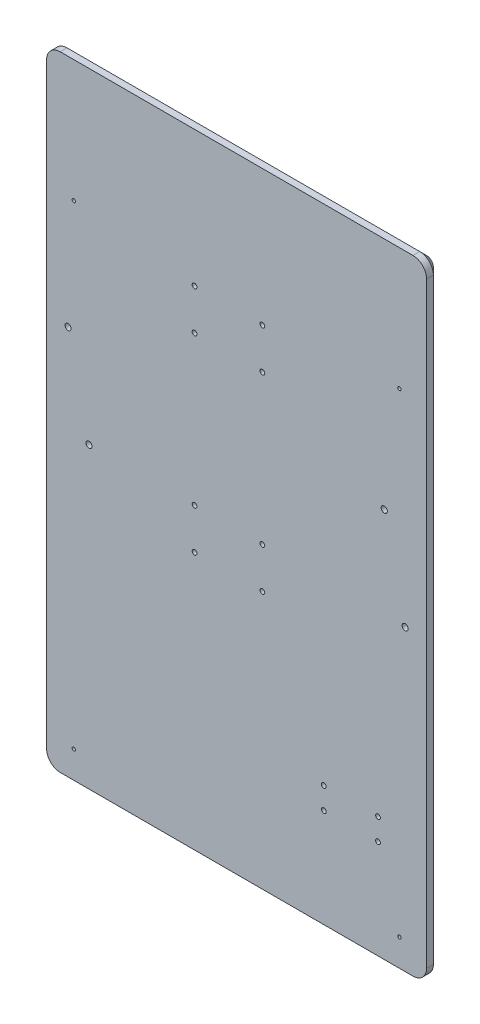
ISO-10303-21;
HEADER;
FILE_DESCRIPTION(('STEP AP214'),'2;1');
FILE_NAME('part.step','',(''),(''),'','','');
FILE_SCHEMA(('AUTOMOTIVE_DESIGN { 1 0 10303 214 1 1 1 1 }'));
ENDSEC;
DATA;
#1=APPLICATION_CONTEXT('core data for automotive mechanical design processes');
#2=APPLICATION_PROTOCOL_DEFINITION('international standard','automotive_design',2000,#1);
#3=PRODUCT_CONTEXT('',#1,'mechanical');
#4=PRODUCT('Part','Part','',(#3));
#5=PRODUCT_RELATED_PRODUCT_CATEGORY('part','',(#4));
#6=PRODUCT_DEFINITION_FORMATION('','',#4);
#7=PRODUCT_DEFINITION_CONTEXT('part definition',#1,'design');
#8=PRODUCT_DEFINITION('design','',#6,#7);
#9=PRODUCT_DEFINITION_SHAPE('','',#8);
#10=(LENGTH_UNIT() NAMED_UNIT(*) SI_UNIT(.MILLI.,.METRE.));
#11=(NAMED_UNIT(*) PLANE_ANGLE_UNIT() SI_UNIT($,.RADIAN.));
#12=(NAMED_UNIT(*) SI_UNIT($,.STERADIAN.) SOLID_ANGLE_UNIT());
#13=UNCERTAINTY_MEASURE_WITH_UNIT(LENGTH_MEASURE(1.E-05),#10,'distance_accuracy_value','');
#14=(GEOMETRIC_REPRESENTATION_CONTEXT(3) GLOBAL_UNCERTAINTY_ASSIGNED_CONTEXT((#13)) GLOBAL_UNIT_ASSIGNED_CONTEXT((#10,
#11,#12)) REPRESENTATION_CONTEXT('',''));
#15=CARTESIAN_POINT('',(0.,0.,0.));
#16=DIRECTION('',(0.,0.,1.));
#17=DIRECTION('',(1.,0.,0.));
#18=AXIS2_PLACEMENT_3D('',#15,#16,#17);
#19=CARTESIAN_POINT('',(146.,234.9692,10.));
#20=DIRECTION('',(-1.,0.,0.));
#21=DIRECTION('',(0.,-1.,0.));
#22=AXIS2_PLACEMENT_3D('',#19,#20,#21);
#23=PLANE('',#22);
#24=DIRECTION('',(0.,0.,-1.));
#25=VECTOR('',#24,1.);
#26=CARTESIAN_POINT('',(146.,-215.0308,10.));
#27=LINE('',#26,#25);
#28=CARTESIAN_POINT('',(146.,-215.0308,10.));
#29=VERTEX_POINT('',#28);
#30=CARTESIAN_POINT('',(146.,-215.0308,5.00000000000006));
#31=VERTEX_POINT('',#30);
#32=EDGE_CURVE('E181',#29,#31,#27,.T.);
#33=ORIENTED_EDGE('',*,*,#32,.T.);
#34=DIRECTION('',(0.,1.,0.));
#35=VECTOR('',#34,1.);
#36=CARTESIAN_POINT('',(146.,224.9692,5.00000000000006));
#37=LINE('',#36,#35);
#38=CARTESIAN_POINT('',(146.,224.9692,5.00000000000006));
#39=VERTEX_POINT('',#38);
#40=EDGE_CURVE('E208',#31,#39,#37,.T.);
#41=ORIENTED_EDGE('',*,*,#40,.T.);
#42=DIRECTION('',(0.,0.,-1.));
#43=VECTOR('',#42,1.);
#44=CARTESIAN_POINT('',(146.,224.9692,10.));
#45=LINE('',#44,#43);
#46=CARTESIAN_POINT('',(146.,224.9692,10.));
#47=VERTEX_POINT('',#46);
#48=EDGE_CURVE('E184',#39,#47,#45,.F.);
#49=ORIENTED_EDGE('',*,*,#48,.T.);
#50=DIRECTION('',(0.,1.,0.));
#51=VECTOR('',#50,1.);
#52=CARTESIAN_POINT('',(146.,234.9692,10.));
#53=LINE('',#52,#51);
#54=EDGE_CURVE('E360',#29,#47,#53,.T.);
#55=ORIENTED_EDGE('',*,*,#54,.F.);
#56=EDGE_LOOP('',(#33,#41,#49,#55));
#57=FACE_BOUND('',#56,.T.);
#58=ADVANCED_FACE('F47',(#57),#23,.F.);
#59=CARTESIAN_POINT('',(146.,234.9692,10.));
#60=DIRECTION('',(0.,-1.,0.));
#61=DIRECTION('',(1.,0.,0.));
#62=AXIS2_PLACEMENT_3D('',#59,#60,#61);
#63=PLANE('',#62);
#64=DIRECTION('',(0.,0.,-1.));
#65=VECTOR('',#64,1.);
#66=CARTESIAN_POINT('',(136.,234.9692,10.));
#67=LINE('',#66,#65);
#68=CARTESIAN_POINT('',(136.,234.9692,10.));
#69=VERTEX_POINT('',#68);
#70=CARTESIAN_POINT('',(136.,234.9692,5.00000000000006));
#71=VERTEX_POINT('',#70);
#72=EDGE_CURVE('E150',#69,#71,#67,.T.);
#73=ORIENTED_EDGE('',*,*,#72,.T.);
#74=DIRECTION('',(-1.,0.,0.));
#75=VECTOR('',#74,1.);
#76=CARTESIAN_POINT('',(-124.,234.9692,5.00000000000006));
#77=LINE('',#76,#75);
#78=CARTESIAN_POINT('',(-124.,234.9692,5.00000000000006));
#79=VERTEX_POINT('',#78);
#80=EDGE_CURVE('E11',#71,#79,#77,.T.);
#81=ORIENTED_EDGE('',*,*,#80,.T.);
#82=DIRECTION('',(0.,0.,-1.));
#83=VECTOR('',#82,1.);
#84=CARTESIAN_POINT('',(-124.,234.9692,10.));
#85=LINE('',#84,#83);
#86=CARTESIAN_POINT('',(-124.,234.9692,10.));
#87=VERTEX_POINT('',#86);
#88=EDGE_CURVE('E179',#79,#87,#85,.F.);
#89=ORIENTED_EDGE('',*,*,#88,.T.);
#90=DIRECTION('',(-1.,0.,0.));
#91=VECTOR('',#90,1.);
#92=CARTESIAN_POINT('',(146.,234.9692,10.));
#93=LINE('',#92,#91);
#94=EDGE_CURVE('E365',#69,#87,#93,.T.);
#95=ORIENTED_EDGE('',*,*,#94,.F.);
#96=EDGE_LOOP('',(#73,#81,#89,#95));
#97=FACE_BOUND('',#96,.T.);
#98=ADVANCED_FACE('F418',(#97),#63,.F.);
#99=CARTESIAN_POINT('',(-134.,234.9692,10.));
#100=DIRECTION('',(1.,0.,0.));
#101=DIRECTION('',(0.,1.,0.));
#102=AXIS2_PLACEMENT_3D('',#99,#100,#101);
#103=PLANE('',#102);
#104=DIRECTION('',(0.,0.,-1.));
#105=VECTOR('',#104,1.);
#106=CARTESIAN_POINT('',(-134.,224.9692,10.));
#107=LINE('',#106,#105);
#108=CARTESIAN_POINT('',(-134.,224.9692,10.));
#109=VERTEX_POINT('',#108);
#110=CARTESIAN_POINT('',(-134.,224.9692,5.00000000000006));
#111=VERTEX_POINT('',#110);
#112=EDGE_CURVE('E165',#109,#111,#107,.T.);
#113=ORIENTED_EDGE('',*,*,#112,.T.);
#114=DIRECTION('',(0.,-1.,0.));
#115=VECTOR('',#114,1.);
#116=CARTESIAN_POINT('',(-134.,-215.0308,5.00000000000006));
#117=LINE('',#116,#115);
#118=CARTESIAN_POINT('',(-134.,-215.0308,5.00000000000006));
#119=VERTEX_POINT('',#118);
#120=EDGE_CURVE('E210',#111,#119,#117,.T.);
#121=ORIENTED_EDGE('',*,*,#120,.T.);
#122=DIRECTION('',(0.,0.,-1.));
#123=VECTOR('',#122,1.);
#124=CARTESIAN_POINT('',(-134.,-215.0308,10.));
#125=LINE('',#124,#123);
#126=CARTESIAN_POINT('',(-134.,-215.0308,10.));
#127=VERTEX_POINT('',#126);
#128=EDGE_CURVE('E168',#119,#127,#125,.F.);
#129=ORIENTED_EDGE('',*,*,#128,.T.);
#130=DIRECTION('',(0.,-1.,0.));
#131=VECTOR('',#130,1.);
#132=CARTESIAN_POINT('',(-134.,234.9692,10.));
#133=LINE('',#132,#131);
#134=EDGE_CURVE('E146',#109,#127,#133,.T.);
#135=ORIENTED_EDGE('',*,*,#134,.F.);
#136=EDGE_LOOP('',(#113,#121,#129,#135));
#137=FACE_BOUND('',#136,.T.);
#138=ADVANCED_FACE('F376',(#137),#103,.F.);
#139=CARTESIAN_POINT('',(146.,-225.0308,10.));
#140=DIRECTION('',(0.,1.,0.));
#141=DIRECTION('',(-1.,0.,0.));
#142=AXIS2_PLACEMENT_3D('',#139,#140,#141);
#143=PLANE('',#142);
#144=DIRECTION('',(0.,0.,-1.));
#145=VECTOR('',#144,1.);
#146=CARTESIAN_POINT('',(-124.,-225.0308,10.));
#147=LINE('',#146,#145);
#148=CARTESIAN_POINT('',(-124.,-225.0308,10.));
#149=VERTEX_POINT('',#148);
#150=CARTESIAN_POINT('',(-124.,-225.0308,5.00000000000006));
#151=VERTEX_POINT('',#150);
#152=EDGE_CURVE('E157',#149,#151,#147,.T.);
#153=ORIENTED_EDGE('',*,*,#152,.T.);
#154=DIRECTION('',(1.,0.,0.));
#155=VECTOR('',#154,1.);
#156=CARTESIAN_POINT('',(136.,-225.0308,5.00000000000006));
#157=LINE('',#156,#155);
#158=CARTESIAN_POINT('',(136.,-225.0308,5.00000000000006));
#159=VERTEX_POINT('',#158);
#160=EDGE_CURVE('E186',#151,#159,#157,.T.);
#161=ORIENTED_EDGE('',*,*,#160,.T.);
#162=DIRECTION('',(0.,0.,-1.));
#163=VECTOR('',#162,1.);
#164=CARTESIAN_POINT('',(136.,-225.0308,10.));
#165=LINE('',#164,#163);
#166=CARTESIAN_POINT('',(136.,-225.0308,10.));
#167=VERTEX_POINT('',#166);
#168=EDGE_CURVE('E160',#159,#167,#165,.F.);
#169=ORIENTED_EDGE('',*,*,#168,.T.);
#170=DIRECTION('',(1.,0.,0.));
#171=VECTOR('',#170,1.);
#172=CARTESIAN_POINT('',(146.,-225.0308,10.));
#173=LINE('',#172,#171);
#174=EDGE_CURVE('E143',#149,#167,#173,.T.);
#175=ORIENTED_EDGE('',*,*,#174,.F.);
#176=EDGE_LOOP('',(#153,#161,#169,#175));
#177=FACE_BOUND('',#176,.T.);
#178=ADVANCED_FACE('F155',(#177),#143,.F.);
#179=CARTESIAN_POINT('',(0.,0.,10.));
#180=DIRECTION('',(0.,0.,-1.));
#181=DIRECTION('',(-1.,0.,0.));
#182=AXIS2_PLACEMENT_3D('',#179,#180,#181);
#183=PLANE('',#182);
#184=CARTESIAN_POINT('',(126.,144.9692,10.));
#185=DIRECTION('',(0.,0.,1.));
#186=DIRECTION('',(1.,0.,0.));
#187=AXIS2_PLACEMENT_3D('',#184,#185,#186);
#188=CIRCLE('',#187,1.25000000000001);
#189=CARTESIAN_POINT('',(127.25,144.9692,10.));
#190=VERTEX_POINT('',#189);
#191=EDGE_CURVE('E249',#190,#190,#188,.T.);
#192=ORIENTED_EDGE('',*,*,#191,.F.);
#193=EDGE_LOOP('',(#192));
#194=FACE_BOUND('',#193,.T.);
#195=CARTESIAN_POINT('',(-114.,-205.0308,10.));
#196=DIRECTION('',(0.,0.,1.));
#197=DIRECTION('',(1.,0.,0.));
#198=AXIS2_PLACEMENT_3D('',#195,#196,#197);
#199=CIRCLE('',#198,1.25);
#200=CARTESIAN_POINT('',(-112.75,-205.0308,10.));
#201=VERTEX_POINT('',#200);
#202=EDGE_CURVE('E256',#201,#201,#199,.T.);
#203=ORIENTED_EDGE('',*,*,#202,.F.);
#204=EDGE_LOOP('',(#203));
#205=FACE_BOUND('',#204,.T.);
#206=CARTESIAN_POINT('',(-114.,144.9692,10.));
#207=DIRECTION('',(0.,0.,1.));
#208=DIRECTION('',(1.,0.,0.));
#209=AXIS2_PLACEMENT_3D('',#206,#207,#208);
#210=CIRCLE('',#209,1.25);
#211=CARTESIAN_POINT('',(-112.75,144.9692,10.));
#212=VERTEX_POINT('',#211);
#213=EDGE_CURVE('E241',#212,#212,#210,.T.);
#214=ORIENTED_EDGE('',*,*,#213,.F.);
#215=EDGE_LOOP('',(#214));
#216=FACE_BOUND('',#215,.T.);
#217=CARTESIAN_POINT('',(126.,-205.0308,10.));
#218=DIRECTION('',(0.,0.,1.));
#219=DIRECTION('',(1.,0.,0.));
#220=AXIS2_PLACEMENT_3D('',#217,#218,#219);
#221=CIRCLE('',#220,1.25000000000001);
#222=CARTESIAN_POINT('',(127.25,-205.0308,10.));
#223=VERTEX_POINT('',#222);
#224=EDGE_CURVE('E252',#223,#223,#221,.T.);
#225=ORIENTED_EDGE('',*,*,#224,.F.);
#226=EDGE_LOOP('',(#225));
#227=FACE_BOUND('',#226,.T.);
#228=CARTESIAN_POINT('',(-102.8,-5.19920000000003,10.));
#229=DIRECTION('',(0.,0.,1.));
#230=DIRECTION('',(1.,0.,0.));
#231=AXIS2_PLACEMENT_3D('',#228,#229,#230);
#232=CIRCLE('',#231,2.25);
#233=CARTESIAN_POINT('',(-100.55,-5.19920000000003,10.));
#234=VERTEX_POINT('',#233);
#235=EDGE_CURVE('E316',#234,#234,#232,.T.);
#236=ORIENTED_EDGE('',*,*,#235,.F.);
#237=EDGE_LOOP('',(#236));
#238=FACE_BOUND('',#237,.T.);
#239=CARTESIAN_POINT('',(-25.,105.,10.));
#240=DIRECTION('',(0.,0.,1.));
#241=DIRECTION('',(1.,0.,0.));
#242=AXIS2_PLACEMENT_3D('',#239,#240,#241);
#243=CIRCLE('',#242,1.75);
#244=CARTESIAN_POINT('',(-23.25,105.,10.));
#245=VERTEX_POINT('',#244);
#246=EDGE_CURVE('E309',#245,#245,#243,.T.);
#247=ORIENTED_EDGE('',*,*,#246,.F.);
#248=EDGE_LOOP('',(#247));
#249=FACE_BOUND('',#248,.T.);
#250=CARTESIAN_POINT('',(-25.,135.,10.));
#251=DIRECTION('',(0.,0.,1.));
#252=DIRECTION('',(1.,0.,0.));
#253=AXIS2_PLACEMENT_3D('',#250,#251,#252);
#254=CIRCLE('',#253,1.75);
#255=CARTESIAN_POINT('',(-23.25,135.,10.));
#256=VERTEX_POINT('',#255);
#257=EDGE_CURVE('E330',#256,#256,#254,.T.);
#258=ORIENTED_EDGE('',*,*,#257,.F.);
#259=EDGE_LOOP('',(#258));
#260=FACE_BOUND('',#259,.T.);
#261=CARTESIAN_POINT('',(25.,105.,10.));
#262=DIRECTION('',(0.,0.,1.));
#263=DIRECTION('',(1.,0.,0.));
#264=AXIS2_PLACEMENT_3D('',#261,#262,#263);
#265=CIRCLE('',#264,1.75);
#266=CARTESIAN_POINT('',(26.75,105.,10.));
#267=VERTEX_POINT('',#266);
#268=EDGE_CURVE('E323',#267,#267,#265,.T.);
#269=ORIENTED_EDGE('',*,*,#268,.F.);
#270=EDGE_LOOP('',(#269));
#271=FACE_BOUND('',#270,.T.);
#272=CARTESIAN_POINT('',(110.186658442972,-152.108914912244,10.));
#273=DIRECTION('',(0.,0.,1.));
#274=DIRECTION('',(1.,0.,0.));
#275=AXIS2_PLACEMENT_3D('',#272,#273,#274);
#276=CIRCLE('',#275,1.75);
#277=CARTESIAN_POINT('',(111.936658442972,-152.108914912244,10.));
#278=VERTEX_POINT('',#277);
#279=EDGE_CURVE('E322',#278,#278,#276,.T.);
#280=ORIENTED_EDGE('',*,*,#279,.F.);
#281=EDGE_LOOP('',(#280));
#282=FACE_BOUND('',#281,.T.);
#283=CARTESIAN_POINT('',(110.204187306603,-136.108924514155,10.));
#284=DIRECTION('',(0.,0.,1.));
#285=DIRECTION('',(1.,0.,0.));
#286=AXIS2_PLACEMENT_3D('',#283,#284,#285);
#287=CIRCLE('',#286,1.75);
#288=CARTESIAN_POINT('',(111.954187306603,-136.108924514155,10.));
#289=VERTEX_POINT('',#288);
#290=EDGE_CURVE('E340',#289,#289,#287,.T.);
#291=ORIENTED_EDGE('',*,*,#290,.F.);
#292=EDGE_LOOP('',(#291));
#293=FACE_BOUND('',#292,.T.);
#294=CARTESIAN_POINT('',(70.3095421855098,-152.214237593331,10.));
#295=DIRECTION('',(0.,0.,1.));
#296=DIRECTION('',(1.,0.,0.));
#297=AXIS2_PLACEMENT_3D('',#294,#295,#296);
#298=CIRCLE('',#297,1.75);
#299=CARTESIAN_POINT('',(72.0595421855098,-152.214237593331,10.));
#300=VERTEX_POINT('',#299);
#301=EDGE_CURVE('E346',#300,#300,#298,.T.);
#302=ORIENTED_EDGE('',*,*,#301,.F.);
#303=EDGE_LOOP('',(#302));
#304=FACE_BOUND('',#303,.T.);
#305=CARTESIAN_POINT('',(70.2074964153003,-136.214563013491,10.));
#306=DIRECTION('',(0.,0.,1.));
#307=DIRECTION('',(1.,0.,0.));
#308=AXIS2_PLACEMENT_3D('',#305,#306,#307);
#309=CIRCLE('',#308,1.75);
#310=CARTESIAN_POINT('',(71.9574964153003,-136.214563013491,10.));
#311=VERTEX_POINT('',#310);
#312=EDGE_CURVE('E352',#311,#311,#309,.T.);
#313=ORIENTED_EDGE('',*,*,#312,.F.);
#314=EDGE_LOOP('',(#313));
#315=FACE_BOUND('',#314,.T.);
#316=CARTESIAN_POINT('',(-25.,-5.,10.));
#317=DIRECTION('',(0.,0.,1.));
#318=DIRECTION('',(1.,0.,0.));
#319=AXIS2_PLACEMENT_3D('',#316,#317,#318);
#320=CIRCLE('',#319,1.75);
#321=CARTESIAN_POINT('',(-23.25,-5.,10.));
#322=VERTEX_POINT('',#321);
#323=EDGE_CURVE('E280',#322,#322,#320,.T.);
#324=ORIENTED_EDGE('',*,*,#323,.F.);
#325=EDGE_LOOP('',(#324));
#326=FACE_BOUND('',#325,.T.);
#327=CARTESIAN_POINT('',(-25.,-35.,10.));
#328=DIRECTION('',(0.,0.,1.));
#329=DIRECTION('',(1.,0.,0.));
#330=AXIS2_PLACEMENT_3D('',#327,#328,#329);
#331=CIRCLE('',#330,1.75);
#332=CARTESIAN_POINT('',(-23.25,-35.,10.));
#333=VERTEX_POINT('',#332);
#334=EDGE_CURVE('E274',#333,#333,#331,.T.);
#335=ORIENTED_EDGE('',*,*,#334,.F.);
#336=EDGE_LOOP('',(#335));
#337=FACE_BOUND('',#336,.T.);
#338=CARTESIAN_POINT('',(25.,-35.,10.));
#339=DIRECTION('',(0.,0.,1.));
#340=DIRECTION('',(1.,0.,0.));
#341=AXIS2_PLACEMENT_3D('',#338,#339,#340);
#342=CIRCLE('',#341,1.75);
#343=CARTESIAN_POINT('',(26.75,-35.,10.));
#344=VERTEX_POINT('',#343);
#345=EDGE_CURVE('E267',#344,#344,#342,.T.);
#346=ORIENTED_EDGE('',*,*,#345,.F.);
#347=EDGE_LOOP('',(#346));
#348=FACE_BOUND('',#347,.T.);
#349=CARTESIAN_POINT('',(25.,-5.,10.));
#350=DIRECTION('',(0.,0.,1.));
#351=DIRECTION('',(1.,0.,0.));
#352=AXIS2_PLACEMENT_3D('',#349,#350,#351);
#353=CIRCLE('',#352,1.75);
#354=CARTESIAN_POINT('',(26.75,-5.,10.));
#355=VERTEX_POINT('',#354);
#356=EDGE_CURVE('E304',#355,#355,#353,.T.);
#357=ORIENTED_EDGE('',*,*,#356,.F.);
#358=EDGE_LOOP('',(#357));
#359=FACE_BOUND('',#358,.T.);
#360=CARTESIAN_POINT('',(-118.2,62.2008,10.));
#361=DIRECTION('',(0.,0.,1.));
#362=DIRECTION('',(1.,0.,0.));
#363=AXIS2_PLACEMENT_3D('',#360,#361,#362);
#364=CIRCLE('',#363,2.25);
#365=CARTESIAN_POINT('',(-115.95,62.2008,10.));
#366=VERTEX_POINT('',#365);
#367=EDGE_CURVE('E298',#366,#366,#364,.T.);
#368=ORIENTED_EDGE('',*,*,#367,.F.);
#369=EDGE_LOOP('',(#368));
#370=FACE_BOUND('',#369,.T.);
#371=CARTESIAN_POINT('',(130.2,-5.19919999999996,10.));
#372=DIRECTION('',(0.,0.,1.));
#373=DIRECTION('',(1.,0.,0.));
#374=AXIS2_PLACEMENT_3D('',#371,#372,#373);
#375=CIRCLE('',#374,2.25000000000001);
#376=CARTESIAN_POINT('',(132.45,-5.19919999999996,10.));
#377=VERTEX_POINT('',#376);
#378=EDGE_CURVE('E292',#377,#377,#375,.T.);
#379=ORIENTED_EDGE('',*,*,#378,.F.);
#380=EDGE_LOOP('',(#379));
#381=FACE_BOUND('',#380,.T.);
#382=CARTESIAN_POINT('',(114.8,62.2008,10.));
#383=DIRECTION('',(0.,0.,1.));
#384=DIRECTION('',(1.,0.,0.));
#385=AXIS2_PLACEMENT_3D('',#382,#383,#384);
#386=CIRCLE('',#385,2.25);
#387=CARTESIAN_POINT('',(117.05,62.2008,10.));
#388=VERTEX_POINT('',#387);
#389=EDGE_CURVE('E285',#388,#388,#386,.T.);
#390=ORIENTED_EDGE('',*,*,#389,.F.);
#391=EDGE_LOOP('',(#390));
#392=FACE_BOUND('',#391,.T.);
#393=CARTESIAN_POINT('',(25.,135.,10.));
#394=DIRECTION('',(0.,0.,1.));
#395=DIRECTION('',(1.,0.,0.));
#396=AXIS2_PLACEMENT_3D('',#393,#394,#395);
#397=CIRCLE('',#396,1.75);
#398=CARTESIAN_POINT('',(26.75,135.,10.));
#399=VERTEX_POINT('',#398);
#400=EDGE_CURVE('E326',#399,#399,#397,.T.);
#401=ORIENTED_EDGE('',*,*,#400,.F.);
#402=EDGE_LOOP('',(#401));
#403=FACE_BOUND('',#402,.T.);
#404=ORIENTED_EDGE('',*,*,#134,.T.);
#405=CARTESIAN_POINT('',(-124.,-215.0308,10.));
#406=DIRECTION('',(0.,0.,-1.));
#407=DIRECTION('',(-1.,0.,0.));
#408=AXIS2_PLACEMENT_3D('',#405,#406,#407);
#409=CIRCLE('',#408,10.);
#410=EDGE_CURVE('E140',#127,#149,#409,.F.);
#411=ORIENTED_EDGE('',*,*,#410,.T.);
#412=ORIENTED_EDGE('',*,*,#174,.T.);
#413=CARTESIAN_POINT('',(136.,-215.0308,10.));
#414=DIRECTION('',(0.,0.,-1.));
#415=DIRECTION('',(-1.,0.,0.));
#416=AXIS2_PLACEMENT_3D('',#413,#414,#415);
#417=CIRCLE('',#416,10.);
#418=EDGE_CURVE('E173',#167,#29,#417,.F.);
#419=ORIENTED_EDGE('',*,*,#418,.T.);
#420=ORIENTED_EDGE('',*,*,#54,.T.);
#421=CARTESIAN_POINT('',(136.,224.9692,10.));
#422=DIRECTION('',(0.,0.,-1.));
#423=DIRECTION('',(-1.,0.,0.));
#424=AXIS2_PLACEMENT_3D('',#421,#422,#423);
#425=CIRCLE('',#424,10.);
#426=EDGE_CURVE('E175',#47,#69,#425,.F.);
#427=ORIENTED_EDGE('',*,*,#426,.T.);
#428=ORIENTED_EDGE('',*,*,#94,.T.);
#429=CARTESIAN_POINT('',(-124.,224.9692,10.));
#430=DIRECTION('',(0.,0.,-1.));
#431=DIRECTION('',(-1.,0.,0.));
#432=AXIS2_PLACEMENT_3D('',#429,#430,#431);
#433=CIRCLE('',#432,10.);
#434=EDGE_CURVE('E151',#87,#109,#433,.F.);
#435=ORIENTED_EDGE('',*,*,#434,.T.);
#436=EDGE_LOOP('',(#404,#411,#412,#419,#420,#427,#428,#435));
#437=FACE_BOUND('',#436,.T.);
#438=ADVANCED_FACE('F142',(#194,#205,#216,#227,#238,#249,#260,#271,#282,#293,#304,#315,#326,
#337,#348,#359,#370,#381,#392,#403,#437),#183,.F.);
#439=CARTESIAN_POINT('',(0.,0.,0.));
#440=DIRECTION('',(0.,0.,-1.));
#441=DIRECTION('',(-1.,0.,0.));
#442=AXIS2_PLACEMENT_3D('',#439,#440,#441);
#443=PLANE('',#442);
#444=CARTESIAN_POINT('',(136.,-215.0308,0.));
#445=DIRECTION('',(0.,0.,-1.));
#446=DIRECTION('',(-1.,0.,0.));
#447=AXIS2_PLACEMENT_3D('',#444,#445,#446);
#448=CIRCLE('',#447,4.99999999999995);
#449=CARTESIAN_POINT('',(141.,-215.0308,0.));
#450=VERTEX_POINT('',#449);
#451=CARTESIAN_POINT('',(136.,-220.0308,0.));
#452=VERTEX_POINT('',#451);
#453=EDGE_CURVE('E200',#450,#452,#448,.T.);
#454=ORIENTED_EDGE('',*,*,#453,.T.);
#455=DIRECTION('',(-1.,0.,0.));
#456=VECTOR('',#455,1.);
#457=CARTESIAN_POINT('',(-124.,-220.0308,0.));
#458=LINE('',#457,#456);
#459=CARTESIAN_POINT('',(-124.,-220.0308,0.));
#460=VERTEX_POINT('',#459);
#461=EDGE_CURVE('E202',#452,#460,#458,.T.);
#462=ORIENTED_EDGE('',*,*,#461,.T.);
#463=CARTESIAN_POINT('',(-124.,-215.0308,0.));
#464=DIRECTION('',(0.,0.,-1.));
#465=DIRECTION('',(-1.,0.,0.));
#466=AXIS2_PLACEMENT_3D('',#463,#464,#465);
#467=CIRCLE('',#466,4.99999999999995);
#468=CARTESIAN_POINT('',(-129.,-215.0308,0.));
#469=VERTEX_POINT('',#468);
#470=EDGE_CURVE('E198',#460,#469,#467,.T.);
#471=ORIENTED_EDGE('',*,*,#470,.T.);
#472=DIRECTION('',(0.,1.,0.));
#473=VECTOR('',#472,1.);
#474=CARTESIAN_POINT('',(-129.,224.9692,0.));
#475=LINE('',#474,#473);
#476=CARTESIAN_POINT('',(-129.,224.9692,0.));
#477=VERTEX_POINT('',#476);
#478=EDGE_CURVE('E194',#469,#477,#475,.T.);
#479=ORIENTED_EDGE('',*,*,#478,.T.);
#480=CARTESIAN_POINT('',(-124.,224.9692,0.));
#481=DIRECTION('',(0.,0.,-1.));
#482=DIRECTION('',(-1.,0.,0.));
#483=AXIS2_PLACEMENT_3D('',#480,#481,#482);
#484=CIRCLE('',#483,4.99999999999992);
#485=CARTESIAN_POINT('',(-124.,229.9692,0.));
#486=VERTEX_POINT('',#485);
#487=EDGE_CURVE('E190',#477,#486,#484,.T.);
#488=ORIENTED_EDGE('',*,*,#487,.T.);
#489=DIRECTION('',(1.,0.,0.));
#490=VECTOR('',#489,1.);
#491=CARTESIAN_POINT('',(136.,229.9692,0.));
#492=LINE('',#491,#490);
#493=CARTESIAN_POINT('',(136.,229.9692,0.));
#494=VERTEX_POINT('',#493);
#495=EDGE_CURVE('E188',#486,#494,#492,.T.);
#496=ORIENTED_EDGE('',*,*,#495,.T.);
#497=CARTESIAN_POINT('',(136.,224.9692,0.));
#498=DIRECTION('',(0.,0.,-1.));
#499=DIRECTION('',(-1.,0.,0.));
#500=AXIS2_PLACEMENT_3D('',#497,#498,#499);
#501=CIRCLE('',#500,4.99999999999995);
#502=CARTESIAN_POINT('',(141.,224.9692,0.));
#503=VERTEX_POINT('',#502);
#504=EDGE_CURVE('E192',#494,#503,#501,.T.);
#505=ORIENTED_EDGE('',*,*,#504,.T.);
#506=DIRECTION('',(0.,-1.,0.));
#507=VECTOR('',#506,1.);
#508=CARTESIAN_POINT('',(141.,-215.0308,0.));
#509=LINE('',#508,#507);
#510=EDGE_CURVE('E196',#503,#450,#509,.T.);
#511=ORIENTED_EDGE('',*,*,#510,.T.);
#512=EDGE_LOOP('',(#454,#462,#471,#479,#488,#496,#505,#511));
#513=FACE_BOUND('',#512,.T.);
#514=CARTESIAN_POINT('',(126.,144.9692,0.));
#515=DIRECTION('',(0.,0.,1.));
#516=DIRECTION('',(1.,0.,0.));
#517=AXIS2_PLACEMENT_3D('',#514,#515,#516);
#518=CIRCLE('',#517,1.25000000000001);
#519=CARTESIAN_POINT('',(127.25,144.9692,0.));
#520=VERTEX_POINT('',#519);
#521=EDGE_CURVE('E253',#520,#520,#518,.T.);
#522=ORIENTED_EDGE('',*,*,#521,.T.);
#523=EDGE_LOOP('',(#522));
#524=FACE_BOUND('',#523,.T.);
#525=CARTESIAN_POINT('',(-114.,-205.0308,0.));
#526=DIRECTION('',(0.,0.,1.));
#527=DIRECTION('',(1.,0.,0.));
#528=AXIS2_PLACEMENT_3D('',#525,#526,#527);
#529=CIRCLE('',#528,1.25);
#530=CARTESIAN_POINT('',(-112.75,-205.0308,0.));
#531=VERTEX_POINT('',#530);
#532=EDGE_CURVE('E246',#531,#531,#529,.T.);
#533=ORIENTED_EDGE('',*,*,#532,.T.);
#534=EDGE_LOOP('',(#533));
#535=FACE_BOUND('',#534,.T.);
#536=CARTESIAN_POINT('',(-114.,144.9692,0.));
#537=DIRECTION('',(0.,0.,1.));
#538=DIRECTION('',(1.,0.,0.));
#539=AXIS2_PLACEMENT_3D('',#536,#537,#538);
#540=CIRCLE('',#539,1.25);
#541=CARTESIAN_POINT('',(-112.75,144.9692,0.));
#542=VERTEX_POINT('',#541);
#543=EDGE_CURVE('E235',#542,#542,#540,.T.);
#544=ORIENTED_EDGE('',*,*,#543,.T.);
#545=EDGE_LOOP('',(#544));
#546=FACE_BOUND('',#545,.T.);
#547=CARTESIAN_POINT('',(126.,-205.0308,0.));
#548=DIRECTION('',(0.,0.,1.));
#549=DIRECTION('',(1.,0.,0.));
#550=AXIS2_PLACEMENT_3D('',#547,#548,#549);
#551=CIRCLE('',#550,1.25000000000001);
#552=CARTESIAN_POINT('',(127.25,-205.0308,0.));
#553=VERTEX_POINT('',#552);
#554=EDGE_CURVE('E261',#553,#553,#551,.T.);
#555=ORIENTED_EDGE('',*,*,#554,.T.);
#556=EDGE_LOOP('',(#555));
#557=FACE_BOUND('',#556,.T.);
#558=CARTESIAN_POINT('',(-102.8,-5.19920000000003,0.));
#559=DIRECTION('',(0.,0.,1.));
#560=DIRECTION('',(1.,0.,0.));
#561=AXIS2_PLACEMENT_3D('',#558,#559,#560);
#562=CIRCLE('',#561,2.25);
#563=CARTESIAN_POINT('',(-100.55,-5.19920000000003,0.));
#564=VERTEX_POINT('',#563);
#565=EDGE_CURVE('E319',#564,#564,#562,.T.);
#566=ORIENTED_EDGE('',*,*,#565,.T.);
#567=EDGE_LOOP('',(#566));
#568=FACE_BOUND('',#567,.T.);
#569=CARTESIAN_POINT('',(-25.,105.,0.));
#570=DIRECTION('',(0.,0.,1.));
#571=DIRECTION('',(1.,0.,0.));
#572=AXIS2_PLACEMENT_3D('',#569,#570,#571);
#573=CIRCLE('',#572,1.75);
#574=CARTESIAN_POINT('',(-23.25,105.,0.));
#575=VERTEX_POINT('',#574);
#576=EDGE_CURVE('E313',#575,#575,#573,.T.);
#577=ORIENTED_EDGE('',*,*,#576,.T.);
#578=EDGE_LOOP('',(#577));
#579=FACE_BOUND('',#578,.T.);
#580=CARTESIAN_POINT('',(-25.,135.,0.));
#581=DIRECTION('',(0.,0.,1.));
#582=DIRECTION('',(1.,0.,0.));
#583=AXIS2_PLACEMENT_3D('',#580,#581,#582);
#584=CIRCLE('',#583,1.75);
#585=CARTESIAN_POINT('',(-23.25,135.,0.));
#586=VERTEX_POINT('',#585);
#587=EDGE_CURVE('E312',#586,#586,#584,.T.);
#588=ORIENTED_EDGE('',*,*,#587,.T.);
#589=EDGE_LOOP('',(#588));
#590=FACE_BOUND('',#589,.T.);
#591=CARTESIAN_POINT('',(25.,105.,0.));
#592=DIRECTION('',(0.,0.,1.));
#593=DIRECTION('',(1.,0.,0.));
#594=AXIS2_PLACEMENT_3D('',#591,#592,#593);
#595=CIRCLE('',#594,1.75);
#596=CARTESIAN_POINT('',(26.75,105.,0.));
#597=VERTEX_POINT('',#596);
#598=EDGE_CURVE('E327',#597,#597,#595,.T.);
#599=ORIENTED_EDGE('',*,*,#598,.T.);
#600=EDGE_LOOP('',(#599));
#601=FACE_BOUND('',#600,.T.);
#602=CARTESIAN_POINT('',(110.186658442972,-152.108914912244,0.));
#603=DIRECTION('',(0.,0.,1.));
#604=DIRECTION('',(1.,0.,0.));
#605=AXIS2_PLACEMENT_3D('',#602,#603,#604);
#606=CIRCLE('',#605,1.75);
#607=CARTESIAN_POINT('',(111.936658442972,-152.108914912244,0.));
#608=VERTEX_POINT('',#607);
#609=EDGE_CURVE('E337',#608,#608,#606,.T.);
#610=ORIENTED_EDGE('',*,*,#609,.T.);
#611=EDGE_LOOP('',(#610));
#612=FACE_BOUND('',#611,.T.);
#613=CARTESIAN_POINT('',(110.204187306603,-136.108924514155,0.));
#614=DIRECTION('',(0.,0.,1.));
#615=DIRECTION('',(1.,0.,0.));
#616=AXIS2_PLACEMENT_3D('',#613,#614,#615);
#617=CIRCLE('',#616,1.75);
#618=CARTESIAN_POINT('',(111.954187306603,-136.108924514155,0.));
#619=VERTEX_POINT('',#618);
#620=EDGE_CURVE('E343',#619,#619,#617,.T.);
#621=ORIENTED_EDGE('',*,*,#620,.T.);
#622=EDGE_LOOP('',(#621));
#623=FACE_BOUND('',#622,.T.);
#624=CARTESIAN_POINT('',(70.3095421855098,-152.214237593331,0.));
#625=DIRECTION('',(0.,0.,1.));
#626=DIRECTION('',(1.,0.,0.));
#627=AXIS2_PLACEMENT_3D('',#624,#625,#626);
#628=CIRCLE('',#627,1.75);
#629=CARTESIAN_POINT('',(72.0595421855098,-152.214237593331,0.));
#630=VERTEX_POINT('',#629);
#631=EDGE_CURVE('E349',#630,#630,#628,.T.);
#632=ORIENTED_EDGE('',*,*,#631,.T.);
#633=EDGE_LOOP('',(#632));
#634=FACE_BOUND('',#633,.T.);
#635=CARTESIAN_POINT('',(70.2074964153003,-136.214563013491,0.));
#636=DIRECTION('',(0.,0.,1.));
#637=DIRECTION('',(1.,0.,0.));
#638=AXIS2_PLACEMENT_3D('',#635,#636,#637);
#639=CIRCLE('',#638,1.75);
#640=CARTESIAN_POINT('',(71.9574964153003,-136.214563013491,0.));
#641=VERTEX_POINT('',#640);
#642=EDGE_CURVE('E288',#641,#641,#639,.T.);
#643=ORIENTED_EDGE('',*,*,#642,.T.);
#644=EDGE_LOOP('',(#643));
#645=FACE_BOUND('',#644,.T.);
#646=CARTESIAN_POINT('',(-25.,-5.,0.));
#647=DIRECTION('',(0.,0.,1.));
#648=DIRECTION('',(1.,0.,0.));
#649=AXIS2_PLACEMENT_3D('',#646,#647,#648);
#650=CIRCLE('',#649,1.75);
#651=CARTESIAN_POINT('',(-23.25,-5.,0.));
#652=VERTEX_POINT('',#651);
#653=EDGE_CURVE('E264',#652,#652,#650,.T.);
#654=ORIENTED_EDGE('',*,*,#653,.T.);
#655=EDGE_LOOP('',(#654));
#656=FACE_BOUND('',#655,.T.);
#657=CARTESIAN_POINT('',(-25.,-35.,0.));
#658=DIRECTION('',(0.,0.,1.));
#659=DIRECTION('',(1.,0.,0.));
#660=AXIS2_PLACEMENT_3D('',#657,#658,#659);
#661=CIRCLE('',#660,1.75);
#662=CARTESIAN_POINT('',(-23.25,-35.,0.));
#663=VERTEX_POINT('',#662);
#664=EDGE_CURVE('E277',#663,#663,#661,.T.);
#665=ORIENTED_EDGE('',*,*,#664,.T.);
#666=EDGE_LOOP('',(#665));
#667=FACE_BOUND('',#666,.T.);
#668=CARTESIAN_POINT('',(25.,-35.,0.));
#669=DIRECTION('',(0.,0.,1.));
#670=DIRECTION('',(1.,0.,0.));
#671=AXIS2_PLACEMENT_3D('',#668,#669,#670);
#672=CIRCLE('',#671,1.75);
#673=CARTESIAN_POINT('',(26.75,-35.,0.));
#674=VERTEX_POINT('',#673);
#675=EDGE_CURVE('E271',#674,#674,#672,.T.);
#676=ORIENTED_EDGE('',*,*,#675,.T.);
#677=EDGE_LOOP('',(#676));
#678=FACE_BOUND('',#677,.T.);
#679=CARTESIAN_POINT('',(25.,-5.,0.));
#680=DIRECTION('',(0.,0.,1.));
#681=DIRECTION('',(1.,0.,0.));
#682=AXIS2_PLACEMENT_3D('',#679,#680,#681);
#683=CIRCLE('',#682,1.75);
#684=CARTESIAN_POINT('',(26.75,-5.,0.));
#685=VERTEX_POINT('',#684);
#686=EDGE_CURVE('E270',#685,#685,#683,.T.);
#687=ORIENTED_EDGE('',*,*,#686,.T.);
#688=EDGE_LOOP('',(#687));
#689=FACE_BOUND('',#688,.T.);
#690=CARTESIAN_POINT('',(-118.2,62.2008,0.));
#691=DIRECTION('',(0.,0.,1.));
#692=DIRECTION('',(1.,0.,0.));
#693=AXIS2_PLACEMENT_3D('',#690,#691,#692);
#694=CIRCLE('',#693,2.25);
#695=CARTESIAN_POINT('',(-115.95,62.2008,0.));
#696=VERTEX_POINT('',#695);
#697=EDGE_CURVE('E301',#696,#696,#694,.T.);
#698=ORIENTED_EDGE('',*,*,#697,.T.);
#699=EDGE_LOOP('',(#698));
#700=FACE_BOUND('',#699,.T.);
#701=CARTESIAN_POINT('',(130.2,-5.19919999999996,0.));
#702=DIRECTION('',(0.,0.,1.));
#703=DIRECTION('',(1.,0.,0.));
#704=AXIS2_PLACEMENT_3D('',#701,#702,#703);
#705=CIRCLE('',#704,2.25000000000001);
#706=CARTESIAN_POINT('',(132.45,-5.19919999999996,0.));
#707=VERTEX_POINT('',#706);
#708=EDGE_CURVE('E295',#707,#707,#705,.T.);
#709=ORIENTED_EDGE('',*,*,#708,.T.);
#710=EDGE_LOOP('',(#709));
#711=FACE_BOUND('',#710,.T.);
#712=CARTESIAN_POINT('',(114.8,62.2008,0.));
#713=DIRECTION('',(0.,0.,1.));
#714=DIRECTION('',(1.,0.,0.));
#715=AXIS2_PLACEMENT_3D('',#712,#713,#714);
#716=CIRCLE('',#715,2.25);
#717=CARTESIAN_POINT('',(117.05,62.2008,0.));
#718=VERTEX_POINT('',#717);
#719=EDGE_CURVE('E289',#718,#718,#716,.T.);
#720=ORIENTED_EDGE('',*,*,#719,.T.);
#721=EDGE_LOOP('',(#720));
#722=FACE_BOUND('',#721,.T.);
#723=CARTESIAN_POINT('',(25.,135.,0.));
#724=DIRECTION('',(0.,0.,1.));
#725=DIRECTION('',(1.,0.,0.));
#726=AXIS2_PLACEMENT_3D('',#723,#724,#725);
#727=CIRCLE('',#726,1.75);
#728=CARTESIAN_POINT('',(26.75,135.,0.));
#729=VERTEX_POINT('',#728);
#730=EDGE_CURVE('E357',#729,#729,#727,.T.);
#731=ORIENTED_EDGE('',*,*,#730,.T.);
#732=EDGE_LOOP('',(#731));
#733=FACE_BOUND('',#732,.T.);
#734=ADVANCED_FACE('F407',(#513,#524,#535,#546,#557,#568,#579,#590,#601,#612,#623,#634,#645,
#656,#667,#678,#689,#700,#711,#722,#733),#443,.T.);
#735=CARTESIAN_POINT('',(25.,135.,0.));
#736=DIRECTION('',(0.,0.,1.));
#737=DIRECTION('',(1.,0.,0.));
#738=AXIS2_PLACEMENT_3D('',#735,#736,#737);
#739=CYLINDRICAL_SURFACE('',#738,1.75);
#740=ORIENTED_EDGE('',*,*,#730,.F.);
#741=EDGE_LOOP('',(#740));
#742=FACE_BOUND('',#741,.T.);
#743=ORIENTED_EDGE('',*,*,#400,.T.);
#744=EDGE_LOOP('',(#743));
#745=FACE_BOUND('',#744,.T.);
#746=ADVANCED_FACE('F703',(#742,#745),#739,.F.);
#747=CARTESIAN_POINT('',(114.8,62.2008,0.));
#748=DIRECTION('',(0.,0.,1.));
#749=DIRECTION('',(1.,0.,0.));
#750=AXIS2_PLACEMENT_3D('',#747,#748,#749);
#751=CYLINDRICAL_SURFACE('',#750,2.25);
#752=ORIENTED_EDGE('',*,*,#719,.F.);
#753=EDGE_LOOP('',(#752));
#754=FACE_BOUND('',#753,.T.);
#755=ORIENTED_EDGE('',*,*,#389,.T.);
#756=EDGE_LOOP('',(#755));
#757=FACE_BOUND('',#756,.T.);
#758=ADVANCED_FACE('F694',(#754,#757),#751,.F.);
#759=CARTESIAN_POINT('',(130.2,-5.19919999999996,0.));
#760=DIRECTION('',(0.,0.,1.));
#761=DIRECTION('',(1.,0.,0.));
#762=AXIS2_PLACEMENT_3D('',#759,#760,#761);
#763=CYLINDRICAL_SURFACE('',#762,2.25000000000001);
#764=ORIENTED_EDGE('',*,*,#708,.F.);
#765=EDGE_LOOP('',(#764));
#766=FACE_BOUND('',#765,.T.);
#767=ORIENTED_EDGE('',*,*,#378,.T.);
#768=EDGE_LOOP('',(#767));
#769=FACE_BOUND('',#768,.T.);
#770=ADVANCED_FACE('F685',(#766,#769),#763,.F.);
#771=CARTESIAN_POINT('',(-118.2,62.2008,0.));
#772=DIRECTION('',(0.,0.,1.));
#773=DIRECTION('',(1.,0.,0.));
#774=AXIS2_PLACEMENT_3D('',#771,#772,#773);
#775=CYLINDRICAL_SURFACE('',#774,2.25);
#776=ORIENTED_EDGE('',*,*,#697,.F.);
#777=EDGE_LOOP('',(#776));
#778=FACE_BOUND('',#777,.T.);
#779=ORIENTED_EDGE('',*,*,#367,.T.);
#780=EDGE_LOOP('',(#779));
#781=FACE_BOUND('',#780,.T.);
#782=ADVANCED_FACE('F676',(#778,#781),#775,.F.);
#783=CARTESIAN_POINT('',(25.,-5.,0.));
#784=DIRECTION('',(0.,0.,1.));
#785=DIRECTION('',(1.,0.,0.));
#786=AXIS2_PLACEMENT_3D('',#783,#784,#785);
#787=CYLINDRICAL_SURFACE('',#786,1.75);
#788=ORIENTED_EDGE('',*,*,#686,.F.);
#789=EDGE_LOOP('',(#788));
#790=FACE_BOUND('',#789,.T.);
#791=ORIENTED_EDGE('',*,*,#356,.T.);
#792=EDGE_LOOP('',(#791));
#793=FACE_BOUND('',#792,.T.);
#794=ADVANCED_FACE('F667',(#790,#793),#787,.F.);
#795=CARTESIAN_POINT('',(25.,-35.,0.));
#796=DIRECTION('',(0.,0.,1.));
#797=DIRECTION('',(1.,0.,0.));
#798=AXIS2_PLACEMENT_3D('',#795,#796,#797);
#799=CYLINDRICAL_SURFACE('',#798,1.75);
#800=ORIENTED_EDGE('',*,*,#675,.F.);
#801=EDGE_LOOP('',(#800));
#802=FACE_BOUND('',#801,.T.);
#803=ORIENTED_EDGE('',*,*,#345,.T.);
#804=EDGE_LOOP('',(#803));
#805=FACE_BOUND('',#804,.T.);
#806=ADVANCED_FACE('F658',(#802,#805),#799,.F.);
#807=CARTESIAN_POINT('',(-25.,-35.,0.));
#808=DIRECTION('',(0.,0.,1.));
#809=DIRECTION('',(1.,0.,0.));
#810=AXIS2_PLACEMENT_3D('',#807,#808,#809);
#811=CYLINDRICAL_SURFACE('',#810,1.75);
#812=ORIENTED_EDGE('',*,*,#664,.F.);
#813=EDGE_LOOP('',(#812));
#814=FACE_BOUND('',#813,.T.);
#815=ORIENTED_EDGE('',*,*,#334,.T.);
#816=EDGE_LOOP('',(#815));
#817=FACE_BOUND('',#816,.T.);
#818=ADVANCED_FACE('F649',(#814,#817),#811,.F.);
#819=CARTESIAN_POINT('',(-25.,-5.,0.));
#820=DIRECTION('',(0.,0.,1.));
#821=DIRECTION('',(1.,0.,0.));
#822=AXIS2_PLACEMENT_3D('',#819,#820,#821);
#823=CYLINDRICAL_SURFACE('',#822,1.75);
#824=ORIENTED_EDGE('',*,*,#653,.F.);
#825=EDGE_LOOP('',(#824));
#826=FACE_BOUND('',#825,.T.);
#827=ORIENTED_EDGE('',*,*,#323,.T.);
#828=EDGE_LOOP('',(#827));
#829=FACE_BOUND('',#828,.T.);
#830=ADVANCED_FACE('F640',(#826,#829),#823,.F.);
#831=CARTESIAN_POINT('',(70.2074964153003,-136.214563013491,0.));
#832=DIRECTION('',(0.,0.,1.));
#833=DIRECTION('',(1.,0.,0.));
#834=AXIS2_PLACEMENT_3D('',#831,#832,#833);
#835=CYLINDRICAL_SURFACE('',#834,1.75);
#836=ORIENTED_EDGE('',*,*,#642,.F.);
#837=EDGE_LOOP('',(#836));
#838=FACE_BOUND('',#837,.T.);
#839=ORIENTED_EDGE('',*,*,#312,.T.);
#840=EDGE_LOOP('',(#839));
#841=FACE_BOUND('',#840,.T.);
#842=ADVANCED_FACE('F631',(#838,#841),#835,.F.);
#843=CARTESIAN_POINT('',(70.3095421855098,-152.214237593331,0.));
#844=DIRECTION('',(0.,0.,1.));
#845=DIRECTION('',(1.,0.,0.));
#846=AXIS2_PLACEMENT_3D('',#843,#844,#845);
#847=CYLINDRICAL_SURFACE('',#846,1.75);
#848=ORIENTED_EDGE('',*,*,#631,.F.);
#849=EDGE_LOOP('',(#848));
#850=FACE_BOUND('',#849,.T.);
#851=ORIENTED_EDGE('',*,*,#301,.T.);
#852=EDGE_LOOP('',(#851));
#853=FACE_BOUND('',#852,.T.);
#854=ADVANCED_FACE('F622',(#850,#853),#847,.F.);
#855=CARTESIAN_POINT('',(110.204187306603,-136.108924514155,0.));
#856=DIRECTION('',(0.,0.,1.));
#857=DIRECTION('',(1.,0.,0.));
#858=AXIS2_PLACEMENT_3D('',#855,#856,#857);
#859=CYLINDRICAL_SURFACE('',#858,1.75);
#860=ORIENTED_EDGE('',*,*,#620,.F.);
#861=EDGE_LOOP('',(#860));
#862=FACE_BOUND('',#861,.T.);
#863=ORIENTED_EDGE('',*,*,#290,.T.);
#864=EDGE_LOOP('',(#863));
#865=FACE_BOUND('',#864,.T.);
#866=ADVANCED_FACE('F613',(#862,#865),#859,.F.);
#867=CARTESIAN_POINT('',(110.186658442972,-152.108914912244,0.));
#868=DIRECTION('',(0.,0.,1.));
#869=DIRECTION('',(1.,0.,0.));
#870=AXIS2_PLACEMENT_3D('',#867,#868,#869);
#871=CYLINDRICAL_SURFACE('',#870,1.75);
#872=ORIENTED_EDGE('',*,*,#609,.F.);
#873=EDGE_LOOP('',(#872));
#874=FACE_BOUND('',#873,.T.);
#875=ORIENTED_EDGE('',*,*,#279,.T.);
#876=EDGE_LOOP('',(#875));
#877=FACE_BOUND('',#876,.T.);
#878=ADVANCED_FACE('F604',(#874,#877),#871,.F.);
#879=CARTESIAN_POINT('',(25.,105.,0.));
#880=DIRECTION('',(0.,0.,1.));
#881=DIRECTION('',(1.,0.,0.));
#882=AXIS2_PLACEMENT_3D('',#879,#880,#881);
#883=CYLINDRICAL_SURFACE('',#882,1.75);
#884=ORIENTED_EDGE('',*,*,#598,.F.);
#885=EDGE_LOOP('',(#884));
#886=FACE_BOUND('',#885,.T.);
#887=ORIENTED_EDGE('',*,*,#268,.T.);
#888=EDGE_LOOP('',(#887));
#889=FACE_BOUND('',#888,.T.);
#890=ADVANCED_FACE('F595',(#886,#889),#883,.F.);
#891=CARTESIAN_POINT('',(-25.,135.,0.));
#892=DIRECTION('',(0.,0.,1.));
#893=DIRECTION('',(1.,0.,0.));
#894=AXIS2_PLACEMENT_3D('',#891,#892,#893);
#895=CYLINDRICAL_SURFACE('',#894,1.75);
#896=ORIENTED_EDGE('',*,*,#587,.F.);
#897=EDGE_LOOP('',(#896));
#898=FACE_BOUND('',#897,.T.);
#899=ORIENTED_EDGE('',*,*,#257,.T.);
#900=EDGE_LOOP('',(#899));
#901=FACE_BOUND('',#900,.T.);
#902=ADVANCED_FACE('F586',(#898,#901),#895,.F.);
#903=CARTESIAN_POINT('',(-25.,105.,0.));
#904=DIRECTION('',(0.,0.,1.));
#905=DIRECTION('',(1.,0.,0.));
#906=AXIS2_PLACEMENT_3D('',#903,#904,#905);
#907=CYLINDRICAL_SURFACE('',#906,1.75);
#908=ORIENTED_EDGE('',*,*,#576,.F.);
#909=EDGE_LOOP('',(#908));
#910=FACE_BOUND('',#909,.T.);
#911=ORIENTED_EDGE('',*,*,#246,.T.);
#912=EDGE_LOOP('',(#911));
#913=FACE_BOUND('',#912,.T.);
#914=ADVANCED_FACE('F577',(#910,#913),#907,.F.);
#915=CARTESIAN_POINT('',(-102.8,-5.19920000000003,0.));
#916=DIRECTION('',(0.,0.,1.));
#917=DIRECTION('',(1.,0.,0.));
#918=AXIS2_PLACEMENT_3D('',#915,#916,#917);
#919=CYLINDRICAL_SURFACE('',#918,2.25);
#920=ORIENTED_EDGE('',*,*,#565,.F.);
#921=EDGE_LOOP('',(#920));
#922=FACE_BOUND('',#921,.T.);
#923=ORIENTED_EDGE('',*,*,#235,.T.);
#924=EDGE_LOOP('',(#923));
#925=FACE_BOUND('',#924,.T.);
#926=ADVANCED_FACE('F568',(#922,#925),#919,.F.);
#927=CARTESIAN_POINT('',(126.,-205.0308,0.));
#928=DIRECTION('',(0.,0.,1.));
#929=DIRECTION('',(1.,0.,0.));
#930=AXIS2_PLACEMENT_3D('',#927,#928,#929);
#931=CYLINDRICAL_SURFACE('',#930,1.25000000000001);
#932=ORIENTED_EDGE('',*,*,#554,.F.);
#933=EDGE_LOOP('',(#932));
#934=FACE_BOUND('',#933,.T.);
#935=ORIENTED_EDGE('',*,*,#224,.T.);
#936=EDGE_LOOP('',(#935));
#937=FACE_BOUND('',#936,.T.);
#938=ADVANCED_FACE('F559',(#934,#937),#931,.F.);
#939=CARTESIAN_POINT('',(-114.,144.9692,0.));
#940=DIRECTION('',(0.,0.,1.));
#941=DIRECTION('',(1.,0.,0.));
#942=AXIS2_PLACEMENT_3D('',#939,#940,#941);
#943=CYLINDRICAL_SURFACE('',#942,1.25);
#944=ORIENTED_EDGE('',*,*,#543,.F.);
#945=EDGE_LOOP('',(#944));
#946=FACE_BOUND('',#945,.T.);
#947=ORIENTED_EDGE('',*,*,#213,.T.);
#948=EDGE_LOOP('',(#947));
#949=FACE_BOUND('',#948,.T.);
#950=ADVANCED_FACE('F550',(#946,#949),#943,.F.);
#951=CARTESIAN_POINT('',(-114.,-205.0308,0.));
#952=DIRECTION('',(0.,0.,1.));
#953=DIRECTION('',(1.,0.,0.));
#954=AXIS2_PLACEMENT_3D('',#951,#952,#953);
#955=CYLINDRICAL_SURFACE('',#954,1.25);
#956=ORIENTED_EDGE('',*,*,#532,.F.);
#957=EDGE_LOOP('',(#956));
#958=FACE_BOUND('',#957,.T.);
#959=ORIENTED_EDGE('',*,*,#202,.T.);
#960=EDGE_LOOP('',(#959));
#961=FACE_BOUND('',#960,.T.);
#962=ADVANCED_FACE('F541',(#958,#961),#955,.F.);
#963=CARTESIAN_POINT('',(126.,144.9692,0.));
#964=DIRECTION('',(0.,0.,1.));
#965=DIRECTION('',(1.,0.,0.));
#966=AXIS2_PLACEMENT_3D('',#963,#964,#965);
#967=CYLINDRICAL_SURFACE('',#966,1.25000000000001);
#968=ORIENTED_EDGE('',*,*,#521,.F.);
#969=EDGE_LOOP('',(#968));
#970=FACE_BOUND('',#969,.T.);
#971=ORIENTED_EDGE('',*,*,#191,.T.);
#972=EDGE_LOOP('',(#971));
#973=FACE_BOUND('',#972,.T.);
#974=ADVANCED_FACE('F429',(#970,#973),#967,.F.);
#975=CARTESIAN_POINT('',(-124.,-215.0308,10.));
#976=DIRECTION('',(0.,0.,-1.));
#977=DIRECTION('',(-1.,0.,0.));
#978=AXIS2_PLACEMENT_3D('',#975,#976,#977);
#979=CYLINDRICAL_SURFACE('',#978,10.);
#980=ORIENTED_EDGE('',*,*,#128,.F.);
#981=CARTESIAN_POINT('',(-124.,-215.0308,5.00000000000006));
#982=DIRECTION('',(0.,0.,-1.));
#983=DIRECTION('',(-1.,0.,0.));
#984=AXIS2_PLACEMENT_3D('',#981,#982,#983);
#985=CIRCLE('',#984,10.);
#986=EDGE_CURVE('E164',#119,#151,#985,.F.);
#987=ORIENTED_EDGE('',*,*,#986,.T.);
#988=ORIENTED_EDGE('',*,*,#152,.F.);
#989=ORIENTED_EDGE('',*,*,#410,.F.);
#990=EDGE_LOOP('',(#980,#987,#988,#989));
#991=FACE_BOUND('',#990,.T.);
#992=ADVANCED_FACE('F162',(#991),#979,.T.);
#993=CARTESIAN_POINT('',(-124.,224.9692,10.));
#994=DIRECTION('',(0.,0.,-1.));
#995=DIRECTION('',(-1.,0.,0.));
#996=AXIS2_PLACEMENT_3D('',#993,#994,#995);
#997=CYLINDRICAL_SURFACE('',#996,10.);
#998=ORIENTED_EDGE('',*,*,#88,.F.);
#999=CARTESIAN_POINT('',(-124.,224.9692,5.00000000000006));
#1000=DIRECTION('',(0.,0.,-1.));
#1001=DIRECTION('',(-1.,0.,0.));
#1002=AXIS2_PLACEMENT_3D('',#999,#1000,#1001);
#1003=CIRCLE('',#1002,10.);
#1004=EDGE_CURVE('E57',#79,#111,#1003,.F.);
#1005=ORIENTED_EDGE('',*,*,#1004,.T.);
#1006=ORIENTED_EDGE('',*,*,#112,.F.);
#1007=ORIENTED_EDGE('',*,*,#434,.F.);
#1008=EDGE_LOOP('',(#998,#1005,#1006,#1007));
#1009=FACE_BOUND('',#1008,.T.);
#1010=ADVANCED_FACE('F373',(#1009),#997,.T.);
#1011=CARTESIAN_POINT('',(136.,224.9692,10.));
#1012=DIRECTION('',(0.,0.,-1.));
#1013=DIRECTION('',(-1.,0.,0.));
#1014=AXIS2_PLACEMENT_3D('',#1011,#1012,#1013);
#1015=CYLINDRICAL_SURFACE('',#1014,10.);
#1016=ORIENTED_EDGE('',*,*,#48,.F.);
#1017=CARTESIAN_POINT('',(136.,224.9692,5.00000000000006));
#1018=DIRECTION('',(0.,0.,-1.));
#1019=DIRECTION('',(-1.,0.,0.));
#1020=AXIS2_PLACEMENT_3D('',#1017,#1018,#1019);
#1021=CIRCLE('',#1020,10.);
#1022=EDGE_CURVE('E71',#39,#71,#1021,.F.);
#1023=ORIENTED_EDGE('',*,*,#1022,.T.);
#1024=ORIENTED_EDGE('',*,*,#72,.F.);
#1025=ORIENTED_EDGE('',*,*,#426,.F.);
#1026=EDGE_LOOP('',(#1016,#1023,#1024,#1025));
#1027=FACE_BOUND('',#1026,.T.);
#1028=ADVANCED_FACE('F398',(#1027),#1015,.T.);
#1029=CARTESIAN_POINT('',(136.,-215.0308,10.));
#1030=DIRECTION('',(0.,0.,-1.));
#1031=DIRECTION('',(-1.,0.,0.));
#1032=AXIS2_PLACEMENT_3D('',#1029,#1030,#1031);
#1033=CYLINDRICAL_SURFACE('',#1032,10.);
#1034=ORIENTED_EDGE('',*,*,#168,.F.);
#1035=CARTESIAN_POINT('',(136.,-215.0308,5.00000000000006));
#1036=DIRECTION('',(0.,0.,-1.));
#1037=DIRECTION('',(-1.,0.,0.));
#1038=AXIS2_PLACEMENT_3D('',#1035,#1036,#1037);
#1039=CIRCLE('',#1038,10.);
#1040=EDGE_CURVE('E205',#159,#31,#1039,.F.);
#1041=ORIENTED_EDGE('',*,*,#1040,.T.);
#1042=ORIENTED_EDGE('',*,*,#32,.F.);
#1043=ORIENTED_EDGE('',*,*,#418,.F.);
#1044=EDGE_LOOP('',(#1034,#1041,#1042,#1043));
#1045=FACE_BOUND('',#1044,.T.);
#1046=ADVANCED_FACE('F393',(#1045),#1033,.T.);
#1047=CARTESIAN_POINT('',(146.,234.9692,5.00000000000006));
#1048=DIRECTION('',(0.,0.707106781186547,-0.707106781186548));
#1049=DIRECTION('',(1.,0.,0.));
#1050=AXIS2_PLACEMENT_3D('',#1047,#1048,#1049);
#1051=PLANE('',#1050);
#1052=DIRECTION('',(0.,0.707106781186547,0.707106781186547));
#1053=VECTOR('',#1052,1.);
#1054=CARTESIAN_POINT('',(136.,229.9692,0.));
#1055=LINE('',#1054,#1053);
#1056=EDGE_CURVE('E229',#494,#71,#1055,.T.);
#1057=ORIENTED_EDGE('',*,*,#1056,.F.);
#1058=ORIENTED_EDGE('',*,*,#495,.F.);
#1059=DIRECTION('',(0.,-0.707106781186547,-0.707106781186547));
#1060=VECTOR('',#1059,1.);
#1061=CARTESIAN_POINT('',(-124.,234.9692,5.00000000000006));
#1062=LINE('',#1061,#1060);
#1063=EDGE_CURVE('E52',#79,#486,#1062,.T.);
#1064=ORIENTED_EDGE('',*,*,#1063,.F.);
#1065=ORIENTED_EDGE('',*,*,#80,.F.);
#1066=EDGE_LOOP('',(#1057,#1058,#1064,#1065));
#1067=FACE_BOUND('',#1066,.T.);
#1068=ADVANCED_FACE('F50',(#1067),#1051,.T.);
#1069=CARTESIAN_POINT('',(-124.,224.9692,0.));
#1070=DIRECTION('',(0.,0.,1.));
#1071=DIRECTION('',(1.,0.,0.));
#1072=AXIS2_PLACEMENT_3D('',#1069,#1070,#1071);
#1073=CONICAL_SURFACE('',#1072,4.99999999999994,0.785398163397449);
#1074=ORIENTED_EDGE('',*,*,#1063,.T.);
#1075=ORIENTED_EDGE('',*,*,#487,.F.);
#1076=DIRECTION('',(0.707106781186548,0.,-0.707106781186548));
#1077=VECTOR('',#1076,1.);
#1078=CARTESIAN_POINT('',(-134.,224.9692,5.00000000000006));
#1079=LINE('',#1078,#1077);
#1080=EDGE_CURVE('E227',#111,#477,#1079,.T.);
#1081=ORIENTED_EDGE('',*,*,#1080,.F.);
#1082=ORIENTED_EDGE('',*,*,#1004,.F.);
#1083=EDGE_LOOP('',(#1074,#1075,#1081,#1082));
#1084=FACE_BOUND('',#1083,.T.);
#1085=ADVANCED_FACE('F378',(#1084),#1073,.T.);
#1086=CARTESIAN_POINT('',(136.,224.9692,0.));
#1087=DIRECTION('',(0.,0.,1.));
#1088=DIRECTION('',(1.,0.,0.));
#1089=AXIS2_PLACEMENT_3D('',#1086,#1087,#1088);
#1090=CONICAL_SURFACE('',#1089,4.99999999999995,0.785398163397447);
#1091=ORIENTED_EDGE('',*,*,#1056,.T.);
#1092=ORIENTED_EDGE('',*,*,#1022,.F.);
#1093=DIRECTION('',(0.707106781186547,0.,0.707106781186547));
#1094=VECTOR('',#1093,1.);
#1095=CARTESIAN_POINT('',(141.,224.9692,0.));
#1096=LINE('',#1095,#1094);
#1097=EDGE_CURVE('E224',#503,#39,#1096,.T.);
#1098=ORIENTED_EDGE('',*,*,#1097,.F.);
#1099=ORIENTED_EDGE('',*,*,#504,.F.);
#1100=EDGE_LOOP('',(#1091,#1092,#1098,#1099));
#1101=FACE_BOUND('',#1100,.T.);
#1102=ADVANCED_FACE('F400',(#1101),#1090,.T.);
#1103=CARTESIAN_POINT('',(-134.,234.9692,5.00000000000006));
#1104=DIRECTION('',(-0.707106781186548,0.,-0.707106781186548));
#1105=DIRECTION('',(0.,1.,0.));
#1106=AXIS2_PLACEMENT_3D('',#1103,#1104,#1105);
#1107=PLANE('',#1106);
#1108=ORIENTED_EDGE('',*,*,#1080,.T.);
#1109=ORIENTED_EDGE('',*,*,#478,.F.);
#1110=DIRECTION('',(0.707106781186548,0.,-0.707106781186548));
#1111=VECTOR('',#1110,1.);
#1112=CARTESIAN_POINT('',(-134.,-215.0308,5.00000000000006));
#1113=LINE('',#1112,#1111);
#1114=EDGE_CURVE('E221',#119,#469,#1113,.T.);
#1115=ORIENTED_EDGE('',*,*,#1114,.F.);
#1116=ORIENTED_EDGE('',*,*,#120,.F.);
#1117=EDGE_LOOP('',(#1108,#1109,#1115,#1116));
#1118=FACE_BOUND('',#1117,.T.);
#1119=ADVANCED_FACE('F382',(#1118),#1107,.T.);
#1120=CARTESIAN_POINT('',(146.,234.9692,5.00000000000006));
#1121=DIRECTION('',(0.707106781186547,0.,-0.707106781186548));
#1122=DIRECTION('',(0.,-1.,0.));
#1123=AXIS2_PLACEMENT_3D('',#1120,#1121,#1122);
#1124=PLANE('',#1123);
#1125=ORIENTED_EDGE('',*,*,#1097,.T.);
#1126=ORIENTED_EDGE('',*,*,#40,.F.);
#1127=DIRECTION('',(0.707106781186547,0.,0.707106781186547));
#1128=VECTOR('',#1127,1.);
#1129=CARTESIAN_POINT('',(141.,-215.0308,0.));
#1130=LINE('',#1129,#1128);
#1131=EDGE_CURVE('E218',#450,#31,#1130,.T.);
#1132=ORIENTED_EDGE('',*,*,#1131,.F.);
#1133=ORIENTED_EDGE('',*,*,#510,.F.);
#1134=EDGE_LOOP('',(#1125,#1126,#1132,#1133));
#1135=FACE_BOUND('',#1134,.T.);
#1136=ADVANCED_FACE('F403',(#1135),#1124,.T.);
#1137=CARTESIAN_POINT('',(-124.,-215.0308,0.));
#1138=DIRECTION('',(0.,0.,1.));
#1139=DIRECTION('',(1.,0.,0.));
#1140=AXIS2_PLACEMENT_3D('',#1137,#1138,#1139);
#1141=CONICAL_SURFACE('',#1140,4.99999999999995,0.785398163397447);
#1142=ORIENTED_EDGE('',*,*,#1114,.T.);
#1143=ORIENTED_EDGE('',*,*,#470,.F.);
#1144=DIRECTION('',(0.,0.707106781186547,-0.707106781186547));
#1145=VECTOR('',#1144,1.);
#1146=CARTESIAN_POINT('',(-124.,-225.0308,5.00000000000006));
#1147=LINE('',#1146,#1145);
#1148=EDGE_CURVE('E216',#151,#460,#1147,.T.);
#1149=ORIENTED_EDGE('',*,*,#1148,.F.);
#1150=ORIENTED_EDGE('',*,*,#986,.F.);
#1151=EDGE_LOOP('',(#1142,#1143,#1149,#1150));
#1152=FACE_BOUND('',#1151,.T.);
#1153=ADVANCED_FACE('F385',(#1152),#1141,.T.);
#1154=CARTESIAN_POINT('',(136.,-215.0308,0.));
#1155=DIRECTION('',(0.,0.,1.));
#1156=DIRECTION('',(1.,0.,0.));
#1157=AXIS2_PLACEMENT_3D('',#1154,#1155,#1156);
#1158=CONICAL_SURFACE('',#1157,4.99999999999995,0.785398163397447);
#1159=ORIENTED_EDGE('',*,*,#1131,.T.);
#1160=ORIENTED_EDGE('',*,*,#1040,.F.);
#1161=DIRECTION('',(0.,-0.707106781186547,0.707106781186547));
#1162=VECTOR('',#1161,1.);
#1163=CARTESIAN_POINT('',(136.,-220.0308,0.));
#1164=LINE('',#1163,#1162);
#1165=EDGE_CURVE('E214',#452,#159,#1164,.T.);
#1166=ORIENTED_EDGE('',*,*,#1165,.F.);
#1167=ORIENTED_EDGE('',*,*,#453,.F.);
#1168=EDGE_LOOP('',(#1159,#1160,#1166,#1167));
#1169=FACE_BOUND('',#1168,.T.);
#1170=ADVANCED_FACE('F440',(#1169),#1158,.T.);
#1171=CARTESIAN_POINT('',(146.,-225.0308,5.00000000000006));
#1172=DIRECTION('',(0.,-0.707106781186548,-0.707106781186547));
#1173=DIRECTION('',(-1.,0.,0.));
#1174=AXIS2_PLACEMENT_3D('',#1171,#1172,#1173);
#1175=PLANE('',#1174);
#1176=ORIENTED_EDGE('',*,*,#1148,.T.);
#1177=ORIENTED_EDGE('',*,*,#461,.F.);
#1178=ORIENTED_EDGE('',*,*,#1165,.T.);
#1179=ORIENTED_EDGE('',*,*,#160,.F.);
#1180=EDGE_LOOP('',(#1176,#1177,#1178,#1179));
#1181=FACE_BOUND('',#1180,.T.);
#1182=ADVANCED_FACE('F389',(#1181),#1175,.T.);
#1183=CLOSED_SHELL('',(#58,#98,#138,#178,#438,#734,#746,#758,#770,#782,#794,#806,#818,#830,#842,
#854,#866,#878,#890,#902,#914,#926,#938,#950,#962,#974,#992,#1010,#1028,#1046,#1068,#1085,#1102,
#1119,#1136,#1153,#1170,#1182));
#1184=MANIFOLD_SOLID_BREP('B2',#1183);
#1185=ADVANCED_BREP_SHAPE_REPRESENTATION('',(#18,#1184),#14);
#1186=SHAPE_DEFINITION_REPRESENTATION(#9,#1185);
ENDSEC;
END-ISO-10303-21;
